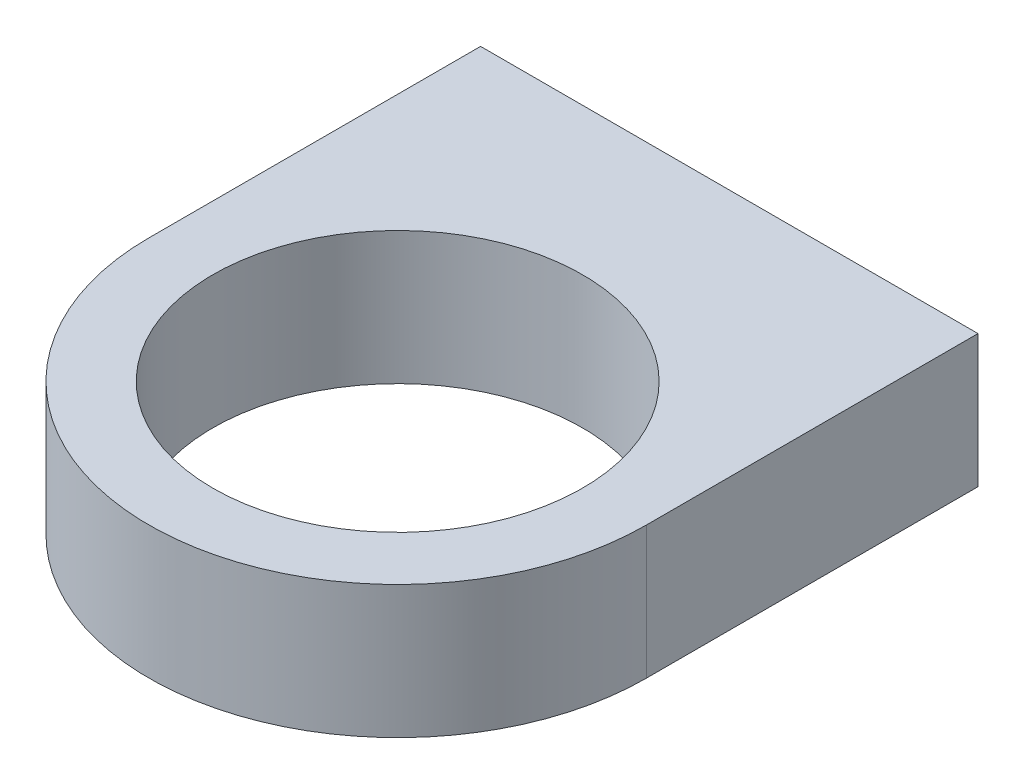
ISO-10303-21;
HEADER;
FILE_DESCRIPTION(('STEP AP214'),'2;1');
FILE_NAME('part.step','',(''),(''),'','','');
FILE_SCHEMA(('AUTOMOTIVE_DESIGN { 1 0 10303 214 1 1 1 1 }'));
ENDSEC;
DATA;
#1=APPLICATION_CONTEXT('core data for automotive mechanical design processes');
#2=APPLICATION_PROTOCOL_DEFINITION('international standard','automotive_design',2000,#1);
#3=PRODUCT_CONTEXT('',#1,'mechanical');
#4=PRODUCT('Part','Part','',(#3));
#5=PRODUCT_RELATED_PRODUCT_CATEGORY('part','',(#4));
#6=PRODUCT_DEFINITION_FORMATION('','',#4);
#7=PRODUCT_DEFINITION_CONTEXT('part definition',#1,'design');
#8=PRODUCT_DEFINITION('design','',#6,#7);
#9=PRODUCT_DEFINITION_SHAPE('','',#8);
#10=(LENGTH_UNIT() NAMED_UNIT(*) SI_UNIT(.MILLI.,.METRE.));
#11=(NAMED_UNIT(*) PLANE_ANGLE_UNIT() SI_UNIT($,.RADIAN.));
#12=(NAMED_UNIT(*) SI_UNIT($,.STERADIAN.) SOLID_ANGLE_UNIT());
#13=UNCERTAINTY_MEASURE_WITH_UNIT(LENGTH_MEASURE(1.E-05),#10,'distance_accuracy_value','');
#14=(GEOMETRIC_REPRESENTATION_CONTEXT(3) GLOBAL_UNCERTAINTY_ASSIGNED_CONTEXT((#13)) GLOBAL_UNIT_ASSIGNED_CONTEXT((#10,
#11,#12)) REPRESENTATION_CONTEXT('',''));
#15=CARTESIAN_POINT('',(0.,0.,0.));
#16=DIRECTION('',(0.,0.,1.));
#17=DIRECTION('',(1.,0.,0.));
#18=AXIS2_PLACEMENT_3D('',#15,#16,#17);
#19=CARTESIAN_POINT('',(0.,8.,0.));
#20=DIRECTION('',(0.,1.,0.));
#21=DIRECTION('',(0.,0.,1.));
#22=AXIS2_PLACEMENT_3D('',#19,#20,#21);
#23=PLANE('',#22);
#24=CARTESIAN_POINT('',(0.,8.,0.));
#25=DIRECTION('',(0.,1.,0.));
#26=DIRECTION('',(0.,0.,1.));
#27=AXIS2_PLACEMENT_3D('',#24,#25,#26);
#28=CIRCLE('',#27,15.);
#29=CARTESIAN_POINT('',(-15.,8.,0.));
#30=VERTEX_POINT('',#29);
#31=CARTESIAN_POINT('',(15.,8.,0.));
#32=VERTEX_POINT('',#31);
#33=EDGE_CURVE('E85',#30,#32,#28,.T.);
#34=ORIENTED_EDGE('',*,*,#33,.T.);
#35=DIRECTION('',(0.,0.,-1.));
#36=VECTOR('',#35,1.);
#37=CARTESIAN_POINT('',(15.,8.,-20.));
#38=LINE('',#37,#36);
#39=CARTESIAN_POINT('',(15.,8.,-20.));
#40=VERTEX_POINT('',#39);
#41=EDGE_CURVE('E80',#32,#40,#38,.T.);
#42=ORIENTED_EDGE('',*,*,#41,.T.);
#43=DIRECTION('',(-1.,0.,0.));
#44=VECTOR('',#43,1.);
#45=CARTESIAN_POINT('',(-15.,8.,-20.));
#46=LINE('',#45,#44);
#47=CARTESIAN_POINT('',(-15.,8.,-20.));
#48=VERTEX_POINT('',#47);
#49=EDGE_CURVE('E83',#40,#48,#46,.T.);
#50=ORIENTED_EDGE('',*,*,#49,.T.);
#51=DIRECTION('',(0.,0.,1.));
#52=VECTOR('',#51,1.);
#53=CARTESIAN_POINT('',(-15.,8.,0.));
#54=LINE('',#53,#52);
#55=EDGE_CURVE('E50',#48,#30,#54,.T.);
#56=ORIENTED_EDGE('',*,*,#55,.T.);
#57=EDGE_LOOP('',(#34,#42,#50,#56));
#58=FACE_BOUND('',#57,.T.);
#59=CARTESIAN_POINT('',(0.,8.,0.));
#60=DIRECTION('',(0.,1.,0.));
#61=DIRECTION('',(0.,0.,1.));
#62=AXIS2_PLACEMENT_3D('',#59,#60,#61);
#63=CIRCLE('',#62,11.15);
#64=CARTESIAN_POINT('',(0.,8.,11.15));
#65=VERTEX_POINT('',#64);
#66=EDGE_CURVE('E100',#65,#65,#63,.T.);
#67=ORIENTED_EDGE('',*,*,#66,.F.);
#68=EDGE_LOOP('',(#67));
#69=FACE_BOUND('',#68,.T.);
#70=ADVANCED_FACE('F33',(#58,#69),#23,.T.);
#71=CARTESIAN_POINT('',(0.,0.,0.));
#72=DIRECTION('',(0.,1.,0.));
#73=DIRECTION('',(0.,0.,1.));
#74=AXIS2_PLACEMENT_3D('',#71,#72,#73);
#75=PLANE('',#74);
#76=CARTESIAN_POINT('',(0.,0.,0.));
#77=DIRECTION('',(0.,1.,0.));
#78=DIRECTION('',(0.,0.,1.));
#79=AXIS2_PLACEMENT_3D('',#76,#77,#78);
#80=CIRCLE('',#79,15.);
#81=CARTESIAN_POINT('',(-15.,0.,0.));
#82=VERTEX_POINT('',#81);
#83=CARTESIAN_POINT('',(15.,0.,0.));
#84=VERTEX_POINT('',#83);
#85=EDGE_CURVE('E97',#82,#84,#80,.T.);
#86=ORIENTED_EDGE('',*,*,#85,.F.);
#87=DIRECTION('',(0.,0.,1.));
#88=VECTOR('',#87,1.);
#89=CARTESIAN_POINT('',(-15.,0.,0.));
#90=LINE('',#89,#88);
#91=CARTESIAN_POINT('',(-15.,0.,-20.));
#92=VERTEX_POINT('',#91);
#93=EDGE_CURVE('E73',#92,#82,#90,.T.);
#94=ORIENTED_EDGE('',*,*,#93,.F.);
#95=DIRECTION('',(-1.,0.,0.));
#96=VECTOR('',#95,1.);
#97=CARTESIAN_POINT('',(-15.,0.,-20.));
#98=LINE('',#97,#96);
#99=CARTESIAN_POINT('',(15.,0.,-20.));
#100=VERTEX_POINT('',#99);
#101=EDGE_CURVE('E67',#100,#92,#98,.T.);
#102=ORIENTED_EDGE('',*,*,#101,.F.);
#103=DIRECTION('',(0.,0.,-1.));
#104=VECTOR('',#103,1.);
#105=CARTESIAN_POINT('',(15.,0.,-20.));
#106=LINE('',#105,#104);
#107=EDGE_CURVE('E89',#84,#100,#106,.T.);
#108=ORIENTED_EDGE('',*,*,#107,.F.);
#109=EDGE_LOOP('',(#86,#94,#102,#108));
#110=FACE_BOUND('',#109,.T.);
#111=CARTESIAN_POINT('',(0.,0.,0.));
#112=DIRECTION('',(0.,1.,0.));
#113=DIRECTION('',(0.,0.,1.));
#114=AXIS2_PLACEMENT_3D('',#111,#112,#113);
#115=CIRCLE('',#114,11.15);
#116=CARTESIAN_POINT('',(0.,0.,11.15));
#117=VERTEX_POINT('',#116);
#118=EDGE_CURVE('E112',#117,#117,#115,.T.);
#119=ORIENTED_EDGE('',*,*,#118,.T.);
#120=EDGE_LOOP('',(#119));
#121=FACE_BOUND('',#120,.T.);
#122=ADVANCED_FACE('F108',(#110,#121),#75,.F.);
#123=CARTESIAN_POINT('',(0.,8.,0.));
#124=DIRECTION('',(0.,-1.,0.));
#125=DIRECTION('',(0.,0.,-1.));
#126=AXIS2_PLACEMENT_3D('',#123,#124,#125);
#127=CYLINDRICAL_SURFACE('',#126,15.);
#128=ORIENTED_EDGE('',*,*,#85,.T.);
#129=DIRECTION('',(0.,-1.,0.));
#130=VECTOR('',#129,1.);
#131=CARTESIAN_POINT('',(15.,8.,0.));
#132=LINE('',#131,#130);
#133=EDGE_CURVE('E11',#32,#84,#132,.T.);
#134=ORIENTED_EDGE('',*,*,#133,.F.);
#135=ORIENTED_EDGE('',*,*,#33,.F.);
#136=DIRECTION('',(0.,-1.,0.));
#137=VECTOR('',#136,1.);
#138=CARTESIAN_POINT('',(-15.,8.,0.));
#139=LINE('',#138,#137);
#140=EDGE_CURVE('E93',#30,#82,#139,.T.);
#141=ORIENTED_EDGE('',*,*,#140,.T.);
#142=EDGE_LOOP('',(#128,#134,#135,#141));
#143=FACE_BOUND('',#142,.T.);
#144=ADVANCED_FACE('F35',(#143),#127,.T.);
#145=CARTESIAN_POINT('',(15.,8.,-20.));
#146=DIRECTION('',(-1.,0.,0.));
#147=DIRECTION('',(0.,0.,1.));
#148=AXIS2_PLACEMENT_3D('',#145,#146,#147);
#149=PLANE('',#148);
#150=ORIENTED_EDGE('',*,*,#107,.T.);
#151=DIRECTION('',(0.,-1.,0.));
#152=VECTOR('',#151,1.);
#153=CARTESIAN_POINT('',(15.,8.,-20.));
#154=LINE('',#153,#152);
#155=EDGE_CURVE('E42',#40,#100,#154,.T.);
#156=ORIENTED_EDGE('',*,*,#155,.F.);
#157=ORIENTED_EDGE('',*,*,#41,.F.);
#158=ORIENTED_EDGE('',*,*,#133,.T.);
#159=EDGE_LOOP('',(#150,#156,#157,#158));
#160=FACE_BOUND('',#159,.T.);
#161=ADVANCED_FACE('F88',(#160),#149,.F.);
#162=CARTESIAN_POINT('',(-15.,8.,-20.));
#163=DIRECTION('',(0.,0.,1.));
#164=DIRECTION('',(1.,0.,0.));
#165=AXIS2_PLACEMENT_3D('',#162,#163,#164);
#166=PLANE('',#165);
#167=ORIENTED_EDGE('',*,*,#101,.T.);
#168=DIRECTION('',(0.,-1.,0.));
#169=VECTOR('',#168,1.);
#170=CARTESIAN_POINT('',(-15.,8.,-20.));
#171=LINE('',#170,#169);
#172=EDGE_CURVE('E90',#48,#92,#171,.T.);
#173=ORIENTED_EDGE('',*,*,#172,.F.);
#174=ORIENTED_EDGE('',*,*,#49,.F.);
#175=ORIENTED_EDGE('',*,*,#155,.T.);
#176=EDGE_LOOP('',(#167,#173,#174,#175));
#177=FACE_BOUND('',#176,.T.);
#178=ADVANCED_FACE('F91',(#177),#166,.F.);
#179=CARTESIAN_POINT('',(-15.,8.,0.));
#180=DIRECTION('',(1.,0.,0.));
#181=DIRECTION('',(0.,0.,-1.));
#182=AXIS2_PLACEMENT_3D('',#179,#180,#181);
#183=PLANE('',#182);
#184=ORIENTED_EDGE('',*,*,#93,.T.);
#185=ORIENTED_EDGE('',*,*,#140,.F.);
#186=ORIENTED_EDGE('',*,*,#55,.F.);
#187=ORIENTED_EDGE('',*,*,#172,.T.);
#188=EDGE_LOOP('',(#184,#185,#186,#187));
#189=FACE_BOUND('',#188,.T.);
#190=ADVANCED_FACE('F105',(#189),#183,.F.);
#191=CARTESIAN_POINT('',(0.,8.,0.));
#192=DIRECTION('',(0.,-1.,0.));
#193=DIRECTION('',(0.,0.,-1.));
#194=AXIS2_PLACEMENT_3D('',#191,#192,#193);
#195=CYLINDRICAL_SURFACE('',#194,11.15);
#196=ORIENTED_EDGE('',*,*,#66,.T.);
#197=EDGE_LOOP('',(#196));
#198=FACE_BOUND('',#197,.T.);
#199=ORIENTED_EDGE('',*,*,#118,.F.);
#200=EDGE_LOOP('',(#199));
#201=FACE_BOUND('',#200,.T.);
#202=ADVANCED_FACE('F118',(#198,#201),#195,.F.);
#203=CLOSED_SHELL('',(#70,#122,#144,#161,#178,#190,#202));
#204=MANIFOLD_SOLID_BREP('B2',#203);
#205=ADVANCED_BREP_SHAPE_REPRESENTATION('',(#18,#204),#14);
#206=SHAPE_DEFINITION_REPRESENTATION(#9,#205);
ENDSEC;
END-ISO-10303-21;
